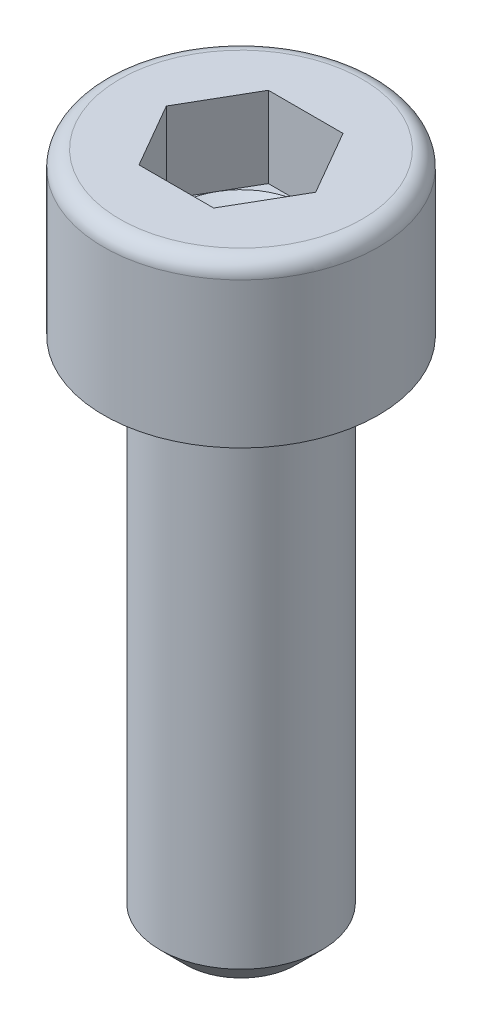
ISO-10303-21;
HEADER;
FILE_DESCRIPTION(('STEP AP214'),'2;1');
FILE_NAME('part.step','',(''),(''),'','','');
FILE_SCHEMA(('AUTOMOTIVE_DESIGN { 1 0 10303 214 1 1 1 1 }'));
ENDSEC;
DATA;
#1=APPLICATION_CONTEXT('core data for automotive mechanical design processes');
#2=APPLICATION_PROTOCOL_DEFINITION('international standard','automotive_design',2000,#1);
#3=PRODUCT_CONTEXT('',#1,'mechanical');
#4=PRODUCT('Part','Part','',(#3));
#5=PRODUCT_RELATED_PRODUCT_CATEGORY('part','',(#4));
#6=PRODUCT_DEFINITION_FORMATION('','',#4);
#7=PRODUCT_DEFINITION_CONTEXT('part definition',#1,'design');
#8=PRODUCT_DEFINITION('design','',#6,#7);
#9=PRODUCT_DEFINITION_SHAPE('','',#8);
#10=(LENGTH_UNIT() NAMED_UNIT(*) SI_UNIT(.MILLI.,.METRE.));
#11=(NAMED_UNIT(*) PLANE_ANGLE_UNIT() SI_UNIT($,.RADIAN.));
#12=(NAMED_UNIT(*) SI_UNIT($,.STERADIAN.) SOLID_ANGLE_UNIT());
#13=UNCERTAINTY_MEASURE_WITH_UNIT(LENGTH_MEASURE(1.E-05),#10,'distance_accuracy_value','');
#14=(GEOMETRIC_REPRESENTATION_CONTEXT(3) GLOBAL_UNCERTAINTY_ASSIGNED_CONTEXT((#13)) GLOBAL_UNIT_ASSIGNED_CONTEXT((#10,
#11,#12)) REPRESENTATION_CONTEXT('',''));
#15=CARTESIAN_POINT('',(0.,0.,0.));
#16=DIRECTION('',(0.,0.,1.));
#17=DIRECTION('',(1.,0.,0.));
#18=AXIS2_PLACEMENT_3D('',#15,#16,#17);
#19=CARTESIAN_POINT('',(2.,5.,0.));
#20=DIRECTION('',(0.,-1.,0.));
#21=DIRECTION('',(1.,0.,0.));
#22=AXIS2_PLACEMENT_3D('',#19,#20,#21);
#23=PLANE('',#22);
#24=CARTESIAN_POINT('',(0.,5.,0.));
#25=DIRECTION('',(0.,1.,0.));
#26=DIRECTION('',(-1.,0.,0.));
#27=AXIS2_PLACEMENT_3D('',#24,#25,#26);
#28=CIRCLE('',#27,3.75);
#29=CARTESIAN_POINT('',(-3.75,5.,0.));
#30=VERTEX_POINT('',#29);
#31=EDGE_CURVE('E138',#30,#30,#28,.T.);
#32=ORIENTED_EDGE('',*,*,#31,.T.);
#33=EDGE_LOOP('',(#32));
#34=FACE_BOUND('',#33,.T.);
#35=DIRECTION('',(0.499999999999998,0.,0.86602540378444));
#36=VECTOR('',#35,1.);
#37=CARTESIAN_POINT('',(1.15470053837925,5.,-2.));
#38=LINE('',#37,#36);
#39=CARTESIAN_POINT('',(1.15470053837925,5.,-2.));
#40=VERTEX_POINT('',#39);
#41=CARTESIAN_POINT('',(2.3094010767585,5.,0.));
#42=VERTEX_POINT('',#41);
#43=EDGE_CURVE('E370',#40,#42,#38,.T.);
#44=ORIENTED_EDGE('',*,*,#43,.T.);
#45=DIRECTION('',(-0.499999999999998,0.,0.86602540378444));
#46=VECTOR('',#45,1.);
#47=CARTESIAN_POINT('',(1.15470053837925,5.,2.));
#48=LINE('',#47,#46);
#49=CARTESIAN_POINT('',(1.15470053837925,5.,2.));
#50=VERTEX_POINT('',#49);
#51=EDGE_CURVE('E373',#42,#50,#48,.T.);
#52=ORIENTED_EDGE('',*,*,#51,.T.);
#53=DIRECTION('',(-1.,0.,0.));
#54=VECTOR('',#53,1.);
#55=CARTESIAN_POINT('',(1.15470053837925,5.,2.));
#56=LINE('',#55,#54);
#57=CARTESIAN_POINT('',(-1.15470053837926,5.,2.));
#58=VERTEX_POINT('',#57);
#59=EDGE_CURVE('E376',#50,#58,#56,.T.);
#60=ORIENTED_EDGE('',*,*,#59,.T.);
#61=DIRECTION('',(-0.499999999999997,0.,-0.86602540378444));
#62=VECTOR('',#61,1.);
#63=CARTESIAN_POINT('',(-1.15470053837926,5.,2.));
#64=LINE('',#63,#62);
#65=CARTESIAN_POINT('',(-2.3094010767585,5.,0.));
#66=VERTEX_POINT('',#65);
#67=EDGE_CURVE('E115',#58,#66,#64,.T.);
#68=ORIENTED_EDGE('',*,*,#67,.T.);
#69=DIRECTION('',(0.499999999999998,0.,-0.86602540378444));
#70=VECTOR('',#69,1.);
#71=CARTESIAN_POINT('',(-1.15470053837925,5.,-2.));
#72=LINE('',#71,#70);
#73=CARTESIAN_POINT('',(-1.15470053837925,5.,-2.));
#74=VERTEX_POINT('',#73);
#75=EDGE_CURVE('E367',#66,#74,#72,.T.);
#76=ORIENTED_EDGE('',*,*,#75,.T.);
#77=DIRECTION('',(1.,0.,0.));
#78=VECTOR('',#77,1.);
#79=CARTESIAN_POINT('',(1.15470053837925,5.,-2.));
#80=LINE('',#79,#78);
#81=EDGE_CURVE('E126',#74,#40,#80,.T.);
#82=ORIENTED_EDGE('',*,*,#81,.T.);
#83=EDGE_LOOP('',(#44,#52,#60,#68,#76,#82));
#84=FACE_BOUND('',#83,.T.);
#85=ADVANCED_FACE('F32',(#34,#84),#23,.F.);
#86=CARTESIAN_POINT('',(0.,-16.,0.));
#87=DIRECTION('',(0.,1.,0.));
#88=DIRECTION('',(0.,0.,1.));
#89=AXIS2_PLACEMENT_3D('',#86,#87,#88);
#90=CYLINDRICAL_SURFACE('',#89,2.5);
#91=CARTESIAN_POINT('',(0.,-15.2,0.));
#92=DIRECTION('',(0.,1.,0.));
#93=DIRECTION('',(0.,0.,1.));
#94=AXIS2_PLACEMENT_3D('',#91,#92,#93);
#95=CIRCLE('',#94,2.5);
#96=CARTESIAN_POINT('',(0.,-15.2,2.5));
#97=VERTEX_POINT('',#96);
#98=EDGE_CURVE('E40',#97,#97,#95,.T.);
#99=ORIENTED_EDGE('',*,*,#98,.T.);
#100=EDGE_LOOP('',(#99));
#101=FACE_BOUND('',#100,.T.);
#102=CARTESIAN_POINT('',(0.,0.,0.));
#103=DIRECTION('',(0.,1.,0.));
#104=DIRECTION('',(0.,0.,1.));
#105=AXIS2_PLACEMENT_3D('',#102,#103,#104);
#106=CIRCLE('',#105,2.5);
#107=CARTESIAN_POINT('',(0.,0.,2.5));
#108=VERTEX_POINT('',#107);
#109=EDGE_CURVE('E148',#108,#108,#106,.T.);
#110=ORIENTED_EDGE('',*,*,#109,.F.);
#111=EDGE_LOOP('',(#110));
#112=FACE_BOUND('',#111,.T.);
#113=ADVANCED_FACE('F153',(#101,#112),#90,.T.);
#114=CARTESIAN_POINT('',(0.,-16.,0.));
#115=DIRECTION('',(0.,1.,0.));
#116=DIRECTION('',(0.,0.,1.));
#117=AXIS2_PLACEMENT_3D('',#114,#115,#116);
#118=PLANE('',#117);
#119=CARTESIAN_POINT('',(0.,-16.,0.));
#120=DIRECTION('',(0.,1.,0.));
#121=DIRECTION('',(0.,0.,1.));
#122=AXIS2_PLACEMENT_3D('',#119,#120,#121);
#123=CIRCLE('',#122,1.7);
#124=CARTESIAN_POINT('',(0.,-16.,1.7));
#125=VERTEX_POINT('',#124);
#126=EDGE_CURVE('E11',#125,#125,#123,.F.);
#127=ORIENTED_EDGE('',*,*,#126,.T.);
#128=EDGE_LOOP('',(#127));
#129=FACE_BOUND('',#128,.T.);
#130=ADVANCED_FACE('F158',(#129),#118,.F.);
#131=CARTESIAN_POINT('',(0.,-15.2,0.));
#132=DIRECTION('',(0.,1.,0.));
#133=DIRECTION('',(0.,0.,1.));
#134=AXIS2_PLACEMENT_3D('',#131,#132,#133);
#135=CONICAL_SURFACE('',#134,2.5,0.78539816339745);
#136=ORIENTED_EDGE('',*,*,#126,.F.);
#137=EDGE_LOOP('',(#136));
#138=FACE_BOUND('',#137,.T.);
#139=ORIENTED_EDGE('',*,*,#98,.F.);
#140=EDGE_LOOP('',(#139));
#141=FACE_BOUND('',#140,.T.);
#142=ADVANCED_FACE('F34',(#138,#141),#135,.T.);
#143=CARTESIAN_POINT('',(0.,0.,0.));
#144=DIRECTION('',(0.,1.,0.));
#145=DIRECTION('',(-1.,0.,0.));
#146=AXIS2_PLACEMENT_3D('',#143,#144,#145);
#147=PLANE('',#146);
#148=ORIENTED_EDGE('',*,*,#109,.T.);
#149=EDGE_LOOP('',(#148));
#150=FACE_BOUND('',#149,.T.);
#151=CARTESIAN_POINT('',(0.,0.,0.));
#152=DIRECTION('',(0.,1.,0.));
#153=DIRECTION('',(-1.,0.,0.));
#154=AXIS2_PLACEMENT_3D('',#151,#152,#153);
#155=CIRCLE('',#154,4.25);
#156=CARTESIAN_POINT('',(-4.25,0.,0.));
#157=VERTEX_POINT('',#156);
#158=EDGE_CURVE('E145',#157,#157,#155,.T.);
#159=ORIENTED_EDGE('',*,*,#158,.F.);
#160=EDGE_LOOP('',(#159));
#161=FACE_BOUND('',#160,.T.);
#162=ADVANCED_FACE('F157',(#150,#161),#147,.F.);
#163=CARTESIAN_POINT('',(0.,5.,0.));
#164=DIRECTION('',(0.,1.,0.));
#165=DIRECTION('',(-1.,0.,0.));
#166=AXIS2_PLACEMENT_3D('',#163,#164,#165);
#167=CYLINDRICAL_SURFACE('',#166,4.25);
#168=CARTESIAN_POINT('',(0.,4.5,0.));
#169=DIRECTION('',(0.,1.,0.));
#170=DIRECTION('',(-1.,0.,0.));
#171=AXIS2_PLACEMENT_3D('',#168,#169,#170);
#172=CIRCLE('',#171,4.25);
#173=CARTESIAN_POINT('',(-4.25,4.5,0.));
#174=VERTEX_POINT('',#173);
#175=EDGE_CURVE('E142',#174,#174,#172,.T.);
#176=ORIENTED_EDGE('',*,*,#175,.F.);
#177=EDGE_LOOP('',(#176));
#178=FACE_BOUND('',#177,.T.);
#179=ORIENTED_EDGE('',*,*,#158,.T.);
#180=EDGE_LOOP('',(#179));
#181=FACE_BOUND('',#180,.T.);
#182=ADVANCED_FACE('F164',(#178,#181),#167,.T.);
#183=CARTESIAN_POINT('',(0.,4.5,0.));
#184=DIRECTION('',(0.,1.,0.));
#185=DIRECTION('',(-1.,0.,0.));
#186=AXIS2_PLACEMENT_3D('',#183,#184,#185);
#187=TOROIDAL_SURFACE('',#186,3.75,0.5);
#188=ORIENTED_EDGE('',*,*,#31,.F.);
#189=EDGE_LOOP('',(#188));
#190=FACE_BOUND('',#189,.T.);
#191=ORIENTED_EDGE('',*,*,#175,.T.);
#192=EDGE_LOOP('',(#191));
#193=FACE_BOUND('',#192,.T.);
#194=ADVANCED_FACE('F181',(#190,#193),#187,.T.);
#195=CARTESIAN_POINT('',(-1.15470053837925,2.5,-2.));
#196=DIRECTION('',(0.86602540378444,0.,0.499999999999998));
#197=DIRECTION('',(0.499999999999998,0.,-0.86602540378444));
#198=AXIS2_PLACEMENT_3D('',#195,#196,#197);
#199=PLANE('',#198);
#200=ORIENTED_EDGE('',*,*,#75,.F.);
#201=DIRECTION('',(0.,1.,0.));
#202=VECTOR('',#201,1.);
#203=CARTESIAN_POINT('',(-2.3094010767585,2.5,0.));
#204=LINE('',#203,#202);
#205=CARTESIAN_POINT('',(-2.3094010767585,2.5,0.));
#206=VERTEX_POINT('',#205);
#207=EDGE_CURVE('E362',#206,#66,#204,.T.);
#208=ORIENTED_EDGE('',*,*,#207,.F.);
#209=DIRECTION('',(0.499999999999998,0.,-0.86602540378444));
#210=VECTOR('',#209,1.);
#211=CARTESIAN_POINT('',(-1.15470053837925,2.5,-2.));
#212=LINE('',#211,#210);
#213=CARTESIAN_POINT('',(-1.73205080756888,2.5,-0.999999999999996));
#214=VERTEX_POINT('',#213);
#215=EDGE_CURVE('E111',#206,#214,#212,.T.);
#216=ORIENTED_EDGE('',*,*,#215,.T.);
#217=CARTESIAN_POINT('',(-1.15470053837925,2.5,-2.));
#218=VERTEX_POINT('',#217);
#219=EDGE_CURVE('E105',#214,#218,#212,.T.);
#220=ORIENTED_EDGE('',*,*,#219,.T.);
#221=DIRECTION('',(0.,1.,0.));
#222=VECTOR('',#221,1.);
#223=CARTESIAN_POINT('',(-1.15470053837925,2.5,-2.));
#224=LINE('',#223,#222);
#225=EDGE_CURVE('E107',#218,#74,#224,.T.);
#226=ORIENTED_EDGE('',*,*,#225,.T.);
#227=EDGE_LOOP('',(#200,#208,#216,#220,#226));
#228=FACE_BOUND('',#227,.T.);
#229=ADVANCED_FACE('F106',(#228),#199,.T.);
#230=CARTESIAN_POINT('',(1.15470053837926,2.5,-2.));
#231=DIRECTION('',(0.,0.,1.));
#232=DIRECTION('',(1.,0.,0.));
#233=AXIS2_PLACEMENT_3D('',#230,#231,#232);
#234=PLANE('',#233);
#235=ORIENTED_EDGE('',*,*,#81,.F.);
#236=ORIENTED_EDGE('',*,*,#225,.F.);
#237=DIRECTION('',(1.,0.,0.));
#238=VECTOR('',#237,1.);
#239=CARTESIAN_POINT('',(1.15470053837926,2.5,-2.));
#240=LINE('',#239,#238);
#241=CARTESIAN_POINT('',(0.,2.5,-2.));
#242=VERTEX_POINT('',#241);
#243=EDGE_CURVE('E47',#218,#242,#240,.T.);
#244=ORIENTED_EDGE('',*,*,#243,.T.);
#245=CARTESIAN_POINT('',(1.15470053837926,2.5,-2.));
#246=VERTEX_POINT('',#245);
#247=EDGE_CURVE('E121',#242,#246,#240,.T.);
#248=ORIENTED_EDGE('',*,*,#247,.T.);
#249=DIRECTION('',(0.,1.,0.));
#250=VECTOR('',#249,1.);
#251=CARTESIAN_POINT('',(1.15470053837926,2.5,-2.));
#252=LINE('',#251,#250);
#253=EDGE_CURVE('E128',#246,#40,#252,.T.);
#254=ORIENTED_EDGE('',*,*,#253,.T.);
#255=EDGE_LOOP('',(#235,#236,#244,#248,#254));
#256=FACE_BOUND('',#255,.T.);
#257=ADVANCED_FACE('F123',(#256),#234,.T.);
#258=CARTESIAN_POINT('',(1.15470053837926,2.5,-2.));
#259=DIRECTION('',(-0.86602540378444,0.,0.499999999999998));
#260=DIRECTION('',(0.499999999999998,0.,0.86602540378444));
#261=AXIS2_PLACEMENT_3D('',#258,#259,#260);
#262=PLANE('',#261);
#263=ORIENTED_EDGE('',*,*,#43,.F.);
#264=ORIENTED_EDGE('',*,*,#253,.F.);
#265=DIRECTION('',(0.499999999999998,0.,0.86602540378444));
#266=VECTOR('',#265,1.);
#267=CARTESIAN_POINT('',(1.15470053837926,2.5,-2.));
#268=LINE('',#267,#266);
#269=CARTESIAN_POINT('',(1.73205080756888,2.5,-0.999999999999996));
#270=VERTEX_POINT('',#269);
#271=EDGE_CURVE('E395',#246,#270,#268,.T.);
#272=ORIENTED_EDGE('',*,*,#271,.T.);
#273=CARTESIAN_POINT('',(2.3094010767585,2.5,0.));
#274=VERTEX_POINT('',#273);
#275=EDGE_CURVE('E120',#270,#274,#268,.T.);
#276=ORIENTED_EDGE('',*,*,#275,.T.);
#277=DIRECTION('',(0.,1.,0.));
#278=VECTOR('',#277,1.);
#279=CARTESIAN_POINT('',(2.3094010767585,2.5,0.));
#280=LINE('',#279,#278);
#281=EDGE_CURVE('E133',#274,#42,#280,.T.);
#282=ORIENTED_EDGE('',*,*,#281,.T.);
#283=EDGE_LOOP('',(#263,#264,#272,#276,#282));
#284=FACE_BOUND('',#283,.T.);
#285=ADVANCED_FACE('F211',(#284),#262,.T.);
#286=CARTESIAN_POINT('',(1.15470053837925,2.5,2.));
#287=DIRECTION('',(-0.86602540378444,0.,-0.499999999999998));
#288=DIRECTION('',(-0.499999999999998,0.,0.86602540378444));
#289=AXIS2_PLACEMENT_3D('',#286,#287,#288);
#290=PLANE('',#289);
#291=ORIENTED_EDGE('',*,*,#51,.F.);
#292=ORIENTED_EDGE('',*,*,#281,.F.);
#293=DIRECTION('',(-0.499999999999998,0.,0.86602540378444));
#294=VECTOR('',#293,1.);
#295=CARTESIAN_POINT('',(1.15470053837925,2.5,2.));
#296=LINE('',#295,#294);
#297=CARTESIAN_POINT('',(1.73205080756888,2.5,0.999999999999995));
#298=VERTEX_POINT('',#297);
#299=EDGE_CURVE('E393',#274,#298,#296,.T.);
#300=ORIENTED_EDGE('',*,*,#299,.T.);
#301=CARTESIAN_POINT('',(1.15470053837925,2.5,2.));
#302=VERTEX_POINT('',#301);
#303=EDGE_CURVE('E394',#298,#302,#296,.T.);
#304=ORIENTED_EDGE('',*,*,#303,.T.);
#305=DIRECTION('',(0.,1.,0.));
#306=VECTOR('',#305,1.);
#307=CARTESIAN_POINT('',(1.15470053837925,2.5,2.));
#308=LINE('',#307,#306);
#309=EDGE_CURVE('E382',#302,#50,#308,.T.);
#310=ORIENTED_EDGE('',*,*,#309,.T.);
#311=EDGE_LOOP('',(#291,#292,#300,#304,#310));
#312=FACE_BOUND('',#311,.T.);
#313=ADVANCED_FACE('F218',(#312),#290,.T.);
#314=CARTESIAN_POINT('',(1.15470053837925,2.5,2.));
#315=DIRECTION('',(0.,0.,-1.));
#316=DIRECTION('',(-1.,0.,0.));
#317=AXIS2_PLACEMENT_3D('',#314,#315,#316);
#318=PLANE('',#317);
#319=ORIENTED_EDGE('',*,*,#59,.F.);
#320=ORIENTED_EDGE('',*,*,#309,.F.);
#321=DIRECTION('',(-1.,0.,0.));
#322=VECTOR('',#321,1.);
#323=CARTESIAN_POINT('',(1.15470053837925,2.5,2.));
#324=LINE('',#323,#322);
#325=CARTESIAN_POINT('',(0.,2.5,2.));
#326=VERTEX_POINT('',#325);
#327=EDGE_CURVE('E357',#302,#326,#324,.T.);
#328=ORIENTED_EDGE('',*,*,#327,.T.);
#329=CARTESIAN_POINT('',(-1.15470053837926,2.5,2.));
#330=VERTEX_POINT('',#329);
#331=EDGE_CURVE('E353',#326,#330,#324,.T.);
#332=ORIENTED_EDGE('',*,*,#331,.T.);
#333=DIRECTION('',(0.,1.,0.));
#334=VECTOR('',#333,1.);
#335=CARTESIAN_POINT('',(-1.15470053837926,2.5,2.));
#336=LINE('',#335,#334);
#337=EDGE_CURVE('E361',#330,#58,#336,.T.);
#338=ORIENTED_EDGE('',*,*,#337,.T.);
#339=EDGE_LOOP('',(#319,#320,#328,#332,#338));
#340=FACE_BOUND('',#339,.T.);
#341=ADVANCED_FACE('F226',(#340),#318,.T.);
#342=CARTESIAN_POINT('',(-1.15470053837926,2.5,2.));
#343=DIRECTION('',(0.86602540378444,0.,-0.499999999999998));
#344=DIRECTION('',(-0.499999999999998,0.,-0.86602540378444));
#345=AXIS2_PLACEMENT_3D('',#342,#343,#344);
#346=PLANE('',#345);
#347=ORIENTED_EDGE('',*,*,#67,.F.);
#348=ORIENTED_EDGE('',*,*,#337,.F.);
#349=DIRECTION('',(-0.499999999999997,0.,-0.86602540378444));
#350=VECTOR('',#349,1.);
#351=CARTESIAN_POINT('',(-1.15470053837926,2.5,2.));
#352=LINE('',#351,#350);
#353=CARTESIAN_POINT('',(-1.73205080756888,2.5,0.999999999999994));
#354=VERTEX_POINT('',#353);
#355=EDGE_CURVE('E352',#330,#354,#352,.T.);
#356=ORIENTED_EDGE('',*,*,#355,.T.);
#357=EDGE_CURVE('E355',#354,#206,#352,.T.);
#358=ORIENTED_EDGE('',*,*,#357,.T.);
#359=ORIENTED_EDGE('',*,*,#207,.T.);
#360=EDGE_LOOP('',(#347,#348,#356,#358,#359));
#361=FACE_BOUND('',#360,.T.);
#362=ADVANCED_FACE('F234',(#361),#346,.T.);
#363=CARTESIAN_POINT('',(-3.46410161513774,2.5,2.));
#364=DIRECTION('',(0.,-1.,0.));
#365=DIRECTION('',(0.,0.,-1.));
#366=AXIS2_PLACEMENT_3D('',#363,#364,#365);
#367=PLANE('',#366);
#368=ORIENTED_EDGE('',*,*,#243,.F.);
#369=ORIENTED_EDGE('',*,*,#219,.F.);
#370=CARTESIAN_POINT('',(0.,2.5,0.));
#371=DIRECTION('',(0.,1.,0.));
#372=DIRECTION('',(-1.,0.,0.));
#373=AXIS2_PLACEMENT_3D('',#370,#371,#372);
#374=CIRCLE('',#373,2.);
#375=EDGE_CURVE('E118',#242,#214,#374,.T.);
#376=ORIENTED_EDGE('',*,*,#375,.F.);
#377=EDGE_LOOP('',(#368,#369,#376));
#378=FACE_BOUND('',#377,.T.);
#379=ADVANCED_FACE('F117',(#378),#367,.F.);
#380=ORIENTED_EDGE('',*,*,#215,.F.);
#381=ORIENTED_EDGE('',*,*,#357,.F.);
#382=EDGE_CURVE('E127',#214,#354,#374,.T.);
#383=ORIENTED_EDGE('',*,*,#382,.F.);
#384=EDGE_LOOP('',(#380,#381,#383));
#385=FACE_BOUND('',#384,.T.);
#386=ADVANCED_FACE('F249',(#385),#367,.F.);
#387=ORIENTED_EDGE('',*,*,#355,.F.);
#388=ORIENTED_EDGE('',*,*,#331,.F.);
#389=EDGE_CURVE('E132',#354,#326,#374,.T.);
#390=ORIENTED_EDGE('',*,*,#389,.F.);
#391=EDGE_LOOP('',(#387,#388,#390));
#392=FACE_BOUND('',#391,.T.);
#393=ADVANCED_FACE('F257',(#392),#367,.F.);
#394=ORIENTED_EDGE('',*,*,#327,.F.);
#395=ORIENTED_EDGE('',*,*,#303,.F.);
#396=EDGE_CURVE('E139',#326,#298,#374,.T.);
#397=ORIENTED_EDGE('',*,*,#396,.F.);
#398=EDGE_LOOP('',(#394,#395,#397));
#399=FACE_BOUND('',#398,.T.);
#400=ADVANCED_FACE('F264',(#399),#367,.F.);
#401=ORIENTED_EDGE('',*,*,#299,.F.);
#402=ORIENTED_EDGE('',*,*,#275,.F.);
#403=EDGE_CURVE('E399',#298,#270,#374,.T.);
#404=ORIENTED_EDGE('',*,*,#403,.F.);
#405=EDGE_LOOP('',(#401,#402,#404));
#406=FACE_BOUND('',#405,.T.);
#407=ADVANCED_FACE('F271',(#406),#367,.F.);
#408=ORIENTED_EDGE('',*,*,#271,.F.);
#409=ORIENTED_EDGE('',*,*,#247,.F.);
#410=EDGE_CURVE('E398',#270,#242,#374,.T.);
#411=ORIENTED_EDGE('',*,*,#410,.F.);
#412=EDGE_LOOP('',(#408,#409,#411));
#413=FACE_BOUND('',#412,.T.);
#414=ADVANCED_FACE('F251',(#413),#367,.F.);
#415=CARTESIAN_POINT('',(0.,2.5,0.));
#416=DIRECTION('',(0.,1.,0.));
#417=DIRECTION('',(-1.,0.,0.));
#418=AXIS2_PLACEMENT_3D('',#415,#416,#417);
#419=CONICAL_SURFACE('',#418,2.,1.04719755119659);
#420=CARTESIAN_POINT('',(0.,1.34529946162074,0.));
#421=VERTEX_POINT('',#420);
#422=VERTEX_LOOP('',#421);
#423=FACE_BOUND('',#422,.T.);
#424=ORIENTED_EDGE('',*,*,#389,.T.);
#425=ORIENTED_EDGE('',*,*,#396,.T.);
#426=ORIENTED_EDGE('',*,*,#403,.T.);
#427=ORIENTED_EDGE('',*,*,#410,.T.);
#428=ORIENTED_EDGE('',*,*,#375,.T.);
#429=ORIENTED_EDGE('',*,*,#382,.T.);
#430=EDGE_LOOP('',(#424,#425,#426,#427,#428,#429));
#431=FACE_BOUND('',#430,.T.);
#432=ADVANCED_FACE('F179',(#423,#431),#419,.F.);
#433=CLOSED_SHELL('',(#85,#113,#130,#142,#162,#182,#194,#229,#257,#285,#313,#341,#362,#379,#386,
#393,#400,#407,#414,#432));
#434=MANIFOLD_SOLID_BREP('B2',#433);
#435=ADVANCED_BREP_SHAPE_REPRESENTATION('',(#18,#434),#14);
#436=SHAPE_DEFINITION_REPRESENTATION(#9,#435);
ENDSEC;
END-ISO-10303-21;
